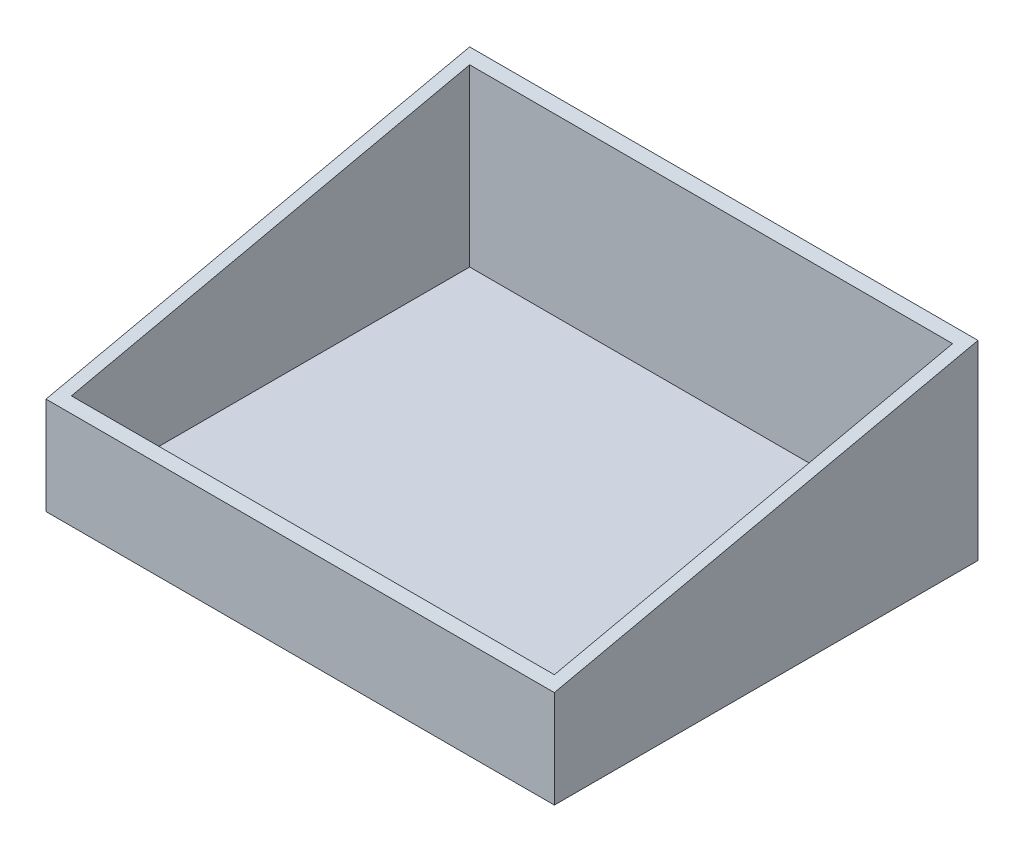
ISO-10303-21;
HEADER;
FILE_DESCRIPTION(('STEP AP214'),'2;1');
FILE_NAME('part.step','',(''),(''),'','','');
FILE_SCHEMA(('AUTOMOTIVE_DESIGN { 1 0 10303 214 1 1 1 1 }'));
ENDSEC;
DATA;
#1=APPLICATION_CONTEXT('core data for automotive mechanical design processes');
#2=APPLICATION_PROTOCOL_DEFINITION('international standard','automotive_design',2000,#1);
#3=PRODUCT_CONTEXT('',#1,'mechanical');
#4=PRODUCT('Part','Part','',(#3));
#5=PRODUCT_RELATED_PRODUCT_CATEGORY('part','',(#4));
#6=PRODUCT_DEFINITION_FORMATION('','',#4);
#7=PRODUCT_DEFINITION_CONTEXT('part definition',#1,'design');
#8=PRODUCT_DEFINITION('design','',#6,#7);
#9=PRODUCT_DEFINITION_SHAPE('','',#8);
#10=(LENGTH_UNIT() NAMED_UNIT(*) SI_UNIT(.MILLI.,.METRE.));
#11=(NAMED_UNIT(*) PLANE_ANGLE_UNIT() SI_UNIT($,.RADIAN.));
#12=(NAMED_UNIT(*) SI_UNIT($,.STERADIAN.) SOLID_ANGLE_UNIT());
#13=UNCERTAINTY_MEASURE_WITH_UNIT(LENGTH_MEASURE(1.E-05),#10,'distance_accuracy_value','');
#14=(GEOMETRIC_REPRESENTATION_CONTEXT(3) GLOBAL_UNCERTAINTY_ASSIGNED_CONTEXT((#13)) GLOBAL_UNIT_ASSIGNED_CONTEXT((#10,
#11,#12)) REPRESENTATION_CONTEXT('',''));
#15=CARTESIAN_POINT('',(0.,0.,0.));
#16=DIRECTION('',(0.,0.,1.));
#17=DIRECTION('',(1.,0.,0.));
#18=AXIS2_PLACEMENT_3D('',#15,#16,#17);
#19=CARTESIAN_POINT('',(0.,45.,-100.));
#20=DIRECTION('',(0.,-0.97664446670509,-0.21486178267512));
#21=DIRECTION('',(0.,0.21486178267512,-0.97664446670509));
#22=AXIS2_PLACEMENT_3D('',#19,#20,#21);
#23=PLANE('',#22);
#24=DIRECTION('',(-1.,0.,0.));
#25=VECTOR('',#24,1.);
#26=CARTESIAN_POINT('',(0.,45.,-100.));
#27=LINE('',#26,#25);
#28=CARTESIAN_POINT('',(120.,45.,-100.));
#29=VERTEX_POINT('',#28);
#30=CARTESIAN_POINT('',(0.,45.,-100.));
#31=VERTEX_POINT('',#30);
#32=EDGE_CURVE('E106',#29,#31,#27,.T.);
#33=ORIENTED_EDGE('',*,*,#32,.T.);
#34=DIRECTION('',(0.,0.21486178267512,-0.97664446670509));
#35=VECTOR('',#34,1.);
#36=CARTESIAN_POINT('',(0.,45.,-100.));
#37=LINE('',#36,#35);
#38=CARTESIAN_POINT('',(0.,23.,0.));
#39=VERTEX_POINT('',#38);
#40=EDGE_CURVE('E129',#39,#31,#37,.T.);
#41=ORIENTED_EDGE('',*,*,#40,.F.);
#42=DIRECTION('',(1.,0.,0.));
#43=VECTOR('',#42,1.);
#44=CARTESIAN_POINT('',(0.,23.,0.));
#45=LINE('',#44,#43);
#46=CARTESIAN_POINT('',(120.,23.,0.));
#47=VERTEX_POINT('',#46);
#48=EDGE_CURVE('E206',#39,#47,#45,.T.);
#49=ORIENTED_EDGE('',*,*,#48,.T.);
#50=DIRECTION('',(0.,-0.21486178267512,0.97664446670509));
#51=VECTOR('',#50,1.);
#52=CARTESIAN_POINT('',(120.,24.0156428843953,-4.61655856543304));
#53=LINE('',#52,#51);
#54=EDGE_CURVE('E72',#29,#47,#53,.T.);
#55=ORIENTED_EDGE('',*,*,#54,.F.);
#56=EDGE_LOOP('',(#33,#41,#49,#55));
#57=FACE_BOUND('',#56,.T.);
#58=DIRECTION('',(-1.,0.,0.));
#59=VECTOR('',#58,1.);
#60=CARTESIAN_POINT('',(0.,44.34,-97.));
#61=LINE('',#60,#59);
#62=CARTESIAN_POINT('',(117.,44.34,-97.));
#63=VERTEX_POINT('',#62);
#64=CARTESIAN_POINT('',(3.,44.34,-97.));
#65=VERTEX_POINT('',#64);
#66=EDGE_CURVE('E197',#63,#65,#61,.T.);
#67=ORIENTED_EDGE('',*,*,#66,.F.);
#68=DIRECTION('',(0.,-0.21486178267512,0.97664446670509));
#69=VECTOR('',#68,1.);
#70=CARTESIAN_POINT('',(117.,24.0156428843953,-4.61655856543304));
#71=LINE('',#70,#69);
#72=CARTESIAN_POINT('',(117.,23.66,-3.));
#73=VERTEX_POINT('',#72);
#74=EDGE_CURVE('E178',#63,#73,#71,.T.);
#75=ORIENTED_EDGE('',*,*,#74,.T.);
#76=DIRECTION('',(1.,0.,0.));
#77=VECTOR('',#76,1.);
#78=CARTESIAN_POINT('',(0.,23.66,-3.00000000000002));
#79=LINE('',#78,#77);
#80=CARTESIAN_POINT('',(3.,23.66,-3.));
#81=VERTEX_POINT('',#80);
#82=EDGE_CURVE('E182',#81,#73,#79,.T.);
#83=ORIENTED_EDGE('',*,*,#82,.F.);
#84=DIRECTION('',(0.,0.21486178267512,-0.97664446670509));
#85=VECTOR('',#84,1.);
#86=CARTESIAN_POINT('',(3.,24.0156428843953,-4.61655856543304));
#87=LINE('',#86,#85);
#88=EDGE_CURVE('E161',#81,#65,#87,.T.);
#89=ORIENTED_EDGE('',*,*,#88,.T.);
#90=EDGE_LOOP('',(#67,#75,#83,#89));
#91=FACE_BOUND('',#90,.T.);
#92=ADVANCED_FACE('F45',(#57,#91),#23,.F.);
#93=CARTESIAN_POINT('',(0.,45.,0.));
#94=DIRECTION('',(1.,0.,0.));
#95=DIRECTION('',(0.,0.,-1.));
#96=AXIS2_PLACEMENT_3D('',#93,#94,#95);
#97=PLANE('',#96);
#98=DIRECTION('',(0.,-1.,0.));
#99=VECTOR('',#98,1.);
#100=CARTESIAN_POINT('',(0.,45.,0.));
#101=LINE('',#100,#99);
#102=CARTESIAN_POINT('',(0.,0.,0.));
#103=VERTEX_POINT('',#102);
#104=EDGE_CURVE('E11',#39,#103,#101,.T.);
#105=ORIENTED_EDGE('',*,*,#104,.F.);
#106=ORIENTED_EDGE('',*,*,#40,.T.);
#107=DIRECTION('',(0.,-1.,0.));
#108=VECTOR('',#107,1.);
#109=CARTESIAN_POINT('',(0.,45.,-100.));
#110=LINE('',#109,#108);
#111=CARTESIAN_POINT('',(0.,0.,-100.));
#112=VERTEX_POINT('',#111);
#113=EDGE_CURVE('E108',#31,#112,#110,.T.);
#114=ORIENTED_EDGE('',*,*,#113,.T.);
#115=DIRECTION('',(0.,0.,1.));
#116=VECTOR('',#115,1.);
#117=CARTESIAN_POINT('',(0.,0.,0.));
#118=LINE('',#117,#116);
#119=EDGE_CURVE('E113',#112,#103,#118,.T.);
#120=ORIENTED_EDGE('',*,*,#119,.T.);
#121=EDGE_LOOP('',(#105,#106,#114,#120));
#122=FACE_BOUND('',#121,.T.);
#123=ADVANCED_FACE('F47',(#122),#97,.F.);
#124=CARTESIAN_POINT('',(0.,45.,0.));
#125=DIRECTION('',(0.,0.,-1.));
#126=DIRECTION('',(-1.,0.,0.));
#127=AXIS2_PLACEMENT_3D('',#124,#125,#126);
#128=PLANE('',#127);
#129=DIRECTION('',(0.,-1.,0.));
#130=VECTOR('',#129,1.);
#131=CARTESIAN_POINT('',(120.,45.,0.));
#132=LINE('',#131,#130);
#133=CARTESIAN_POINT('',(120.,0.,0.));
#134=VERTEX_POINT('',#133);
#135=EDGE_CURVE('E55',#47,#134,#132,.T.);
#136=ORIENTED_EDGE('',*,*,#135,.F.);
#137=ORIENTED_EDGE('',*,*,#48,.F.);
#138=ORIENTED_EDGE('',*,*,#104,.T.);
#139=DIRECTION('',(1.,0.,0.));
#140=VECTOR('',#139,1.);
#141=CARTESIAN_POINT('',(0.,0.,0.));
#142=LINE('',#141,#140);
#143=EDGE_CURVE('E100',#103,#134,#142,.T.);
#144=ORIENTED_EDGE('',*,*,#143,.T.);
#145=EDGE_LOOP('',(#136,#137,#138,#144));
#146=FACE_BOUND('',#145,.T.);
#147=ADVANCED_FACE('F216',(#146),#128,.F.);
#148=CARTESIAN_POINT('',(120.,45.,0.));
#149=DIRECTION('',(-1.,0.,0.));
#150=DIRECTION('',(0.,0.,1.));
#151=AXIS2_PLACEMENT_3D('',#148,#149,#150);
#152=PLANE('',#151);
#153=DIRECTION('',(0.,-1.,0.));
#154=VECTOR('',#153,1.);
#155=CARTESIAN_POINT('',(120.,45.,-100.));
#156=LINE('',#155,#154);
#157=CARTESIAN_POINT('',(120.,0.,-100.));
#158=VERTEX_POINT('',#157);
#159=EDGE_CURVE('E91',#29,#158,#156,.T.);
#160=ORIENTED_EDGE('',*,*,#159,.F.);
#161=ORIENTED_EDGE('',*,*,#54,.T.);
#162=ORIENTED_EDGE('',*,*,#135,.T.);
#163=DIRECTION('',(0.,0.,-1.));
#164=VECTOR('',#163,1.);
#165=CARTESIAN_POINT('',(120.,0.,0.));
#166=LINE('',#165,#164);
#167=EDGE_CURVE('E88',#134,#158,#166,.T.);
#168=ORIENTED_EDGE('',*,*,#167,.T.);
#169=EDGE_LOOP('',(#160,#161,#162,#168));
#170=FACE_BOUND('',#169,.T.);
#171=ADVANCED_FACE('F90',(#170),#152,.F.);
#172=CARTESIAN_POINT('',(0.,45.,-100.));
#173=DIRECTION('',(0.,0.,1.));
#174=DIRECTION('',(1.,0.,0.));
#175=AXIS2_PLACEMENT_3D('',#172,#173,#174);
#176=PLANE('',#175);
#177=DIRECTION('',(-1.,0.,0.));
#178=VECTOR('',#177,1.);
#179=CARTESIAN_POINT('',(0.,0.,-100.));
#180=LINE('',#179,#178);
#181=EDGE_CURVE('E99',#158,#112,#180,.T.);
#182=ORIENTED_EDGE('',*,*,#181,.T.);
#183=ORIENTED_EDGE('',*,*,#113,.F.);
#184=ORIENTED_EDGE('',*,*,#32,.F.);
#185=ORIENTED_EDGE('',*,*,#159,.T.);
#186=EDGE_LOOP('',(#182,#183,#184,#185));
#187=FACE_BOUND('',#186,.T.);
#188=ADVANCED_FACE('F103',(#187),#176,.F.);
#189=CARTESIAN_POINT('',(0.,0.,0.));
#190=DIRECTION('',(0.,-1.,0.));
#191=DIRECTION('',(0.,0.,-1.));
#192=AXIS2_PLACEMENT_3D('',#189,#190,#191);
#193=PLANE('',#192);
#194=ORIENTED_EDGE('',*,*,#119,.F.);
#195=ORIENTED_EDGE('',*,*,#181,.F.);
#196=ORIENTED_EDGE('',*,*,#167,.F.);
#197=ORIENTED_EDGE('',*,*,#143,.F.);
#198=EDGE_LOOP('',(#194,#195,#196,#197));
#199=FACE_BOUND('',#198,.T.);
#200=ADVANCED_FACE('F111',(#199),#193,.T.);
#201=CARTESIAN_POINT('',(3.,45.,0.));
#202=DIRECTION('',(1.,0.,0.));
#203=DIRECTION('',(0.,0.,-1.));
#204=AXIS2_PLACEMENT_3D('',#201,#202,#203);
#205=PLANE('',#204);
#206=DIRECTION('',(0.,-1.,0.));
#207=VECTOR('',#206,1.);
#208=CARTESIAN_POINT('',(3.,45.,-3.));
#209=LINE('',#208,#207);
#210=CARTESIAN_POINT('',(3.,3.,-3.));
#211=VERTEX_POINT('',#210);
#212=EDGE_CURVE('E154',#81,#211,#209,.T.);
#213=ORIENTED_EDGE('',*,*,#212,.T.);
#214=DIRECTION('',(0.,0.,1.));
#215=VECTOR('',#214,1.);
#216=CARTESIAN_POINT('',(3.,3.,0.));
#217=LINE('',#216,#215);
#218=CARTESIAN_POINT('',(3.,3.,-97.));
#219=VERTEX_POINT('',#218);
#220=EDGE_CURVE('E159',#219,#211,#217,.T.);
#221=ORIENTED_EDGE('',*,*,#220,.F.);
#222=DIRECTION('',(0.,-1.,0.));
#223=VECTOR('',#222,1.);
#224=CARTESIAN_POINT('',(3.,45.,-97.));
#225=LINE('',#224,#223);
#226=EDGE_CURVE('E186',#65,#219,#225,.T.);
#227=ORIENTED_EDGE('',*,*,#226,.F.);
#228=ORIENTED_EDGE('',*,*,#88,.F.);
#229=EDGE_LOOP('',(#213,#221,#227,#228));
#230=FACE_BOUND('',#229,.T.);
#231=ADVANCED_FACE('F156',(#230),#205,.T.);
#232=CARTESIAN_POINT('',(0.,45.,-3.));
#233=DIRECTION('',(0.,0.,-1.));
#234=DIRECTION('',(-1.,0.,0.));
#235=AXIS2_PLACEMENT_3D('',#232,#233,#234);
#236=PLANE('',#235);
#237=DIRECTION('',(0.,-1.,0.));
#238=VECTOR('',#237,1.);
#239=CARTESIAN_POINT('',(117.,45.,-3.));
#240=LINE('',#239,#238);
#241=CARTESIAN_POINT('',(117.,3.,-3.));
#242=VERTEX_POINT('',#241);
#243=EDGE_CURVE('E63',#73,#242,#240,.T.);
#244=ORIENTED_EDGE('',*,*,#243,.T.);
#245=DIRECTION('',(1.,0.,0.));
#246=VECTOR('',#245,1.);
#247=CARTESIAN_POINT('',(0.,3.,-3.));
#248=LINE('',#247,#246);
#249=EDGE_CURVE('E167',#211,#242,#248,.T.);
#250=ORIENTED_EDGE('',*,*,#249,.F.);
#251=ORIENTED_EDGE('',*,*,#212,.F.);
#252=ORIENTED_EDGE('',*,*,#82,.T.);
#253=EDGE_LOOP('',(#244,#250,#251,#252));
#254=FACE_BOUND('',#253,.T.);
#255=ADVANCED_FACE('F168',(#254),#236,.T.);
#256=CARTESIAN_POINT('',(117.,45.,0.));
#257=DIRECTION('',(-1.,0.,0.));
#258=DIRECTION('',(0.,0.,1.));
#259=AXIS2_PLACEMENT_3D('',#256,#257,#258);
#260=PLANE('',#259);
#261=DIRECTION('',(0.,-1.,0.));
#262=VECTOR('',#261,1.);
#263=CARTESIAN_POINT('',(117.,45.,-97.));
#264=LINE('',#263,#262);
#265=CARTESIAN_POINT('',(117.,3.,-97.));
#266=VERTEX_POINT('',#265);
#267=EDGE_CURVE('E188',#63,#266,#264,.T.);
#268=ORIENTED_EDGE('',*,*,#267,.T.);
#269=DIRECTION('',(0.,0.,-1.));
#270=VECTOR('',#269,1.);
#271=CARTESIAN_POINT('',(117.,3.,0.));
#272=LINE('',#271,#270);
#273=EDGE_CURVE('E171',#242,#266,#272,.T.);
#274=ORIENTED_EDGE('',*,*,#273,.F.);
#275=ORIENTED_EDGE('',*,*,#243,.F.);
#276=ORIENTED_EDGE('',*,*,#74,.F.);
#277=EDGE_LOOP('',(#268,#274,#275,#276));
#278=FACE_BOUND('',#277,.T.);
#279=ADVANCED_FACE('F226',(#278),#260,.T.);
#280=CARTESIAN_POINT('',(0.,45.,-97.));
#281=DIRECTION('',(0.,0.,1.));
#282=DIRECTION('',(1.,0.,0.));
#283=AXIS2_PLACEMENT_3D('',#280,#281,#282);
#284=PLANE('',#283);
#285=DIRECTION('',(-1.,0.,0.));
#286=VECTOR('',#285,1.);
#287=CARTESIAN_POINT('',(0.,3.,-97.));
#288=LINE('',#287,#286);
#289=EDGE_CURVE('E175',#266,#219,#288,.T.);
#290=ORIENTED_EDGE('',*,*,#289,.F.);
#291=ORIENTED_EDGE('',*,*,#267,.F.);
#292=ORIENTED_EDGE('',*,*,#66,.T.);
#293=ORIENTED_EDGE('',*,*,#226,.T.);
#294=EDGE_LOOP('',(#290,#291,#292,#293));
#295=FACE_BOUND('',#294,.T.);
#296=ADVANCED_FACE('F224',(#295),#284,.T.);
#297=CARTESIAN_POINT('',(0.,3.,0.));
#298=DIRECTION('',(0.,-1.,0.));
#299=DIRECTION('',(0.,0.,-1.));
#300=AXIS2_PLACEMENT_3D('',#297,#298,#299);
#301=PLANE('',#300);
#302=ORIENTED_EDGE('',*,*,#220,.T.);
#303=ORIENTED_EDGE('',*,*,#249,.T.);
#304=ORIENTED_EDGE('',*,*,#273,.T.);
#305=ORIENTED_EDGE('',*,*,#289,.T.);
#306=EDGE_LOOP('',(#302,#303,#304,#305));
#307=FACE_BOUND('',#306,.T.);
#308=ADVANCED_FACE('F173',(#307),#301,.F.);
#309=CLOSED_SHELL('',(#92,#123,#147,#171,#188,#200,#231,#255,#279,#296,#308));
#310=MANIFOLD_SOLID_BREP('B2',#309);
#311=ADVANCED_BREP_SHAPE_REPRESENTATION('',(#18,#310),#14);
#312=SHAPE_DEFINITION_REPRESENTATION(#9,#311);
ENDSEC;
END-ISO-10303-21;
